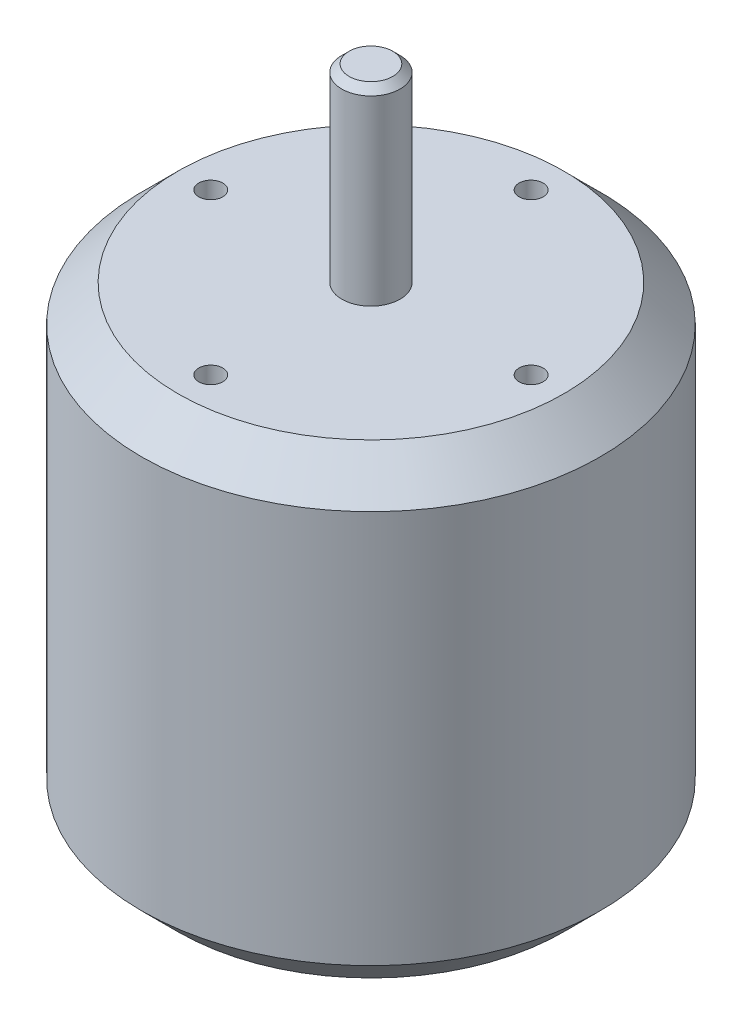
ISO-10303-21;
HEADER;
FILE_DESCRIPTION(('STEP AP214'),'2;1');
FILE_NAME('part.step','',(''),(''),'','','');
FILE_SCHEMA(('AUTOMOTIVE_DESIGN { 1 0 10303 214 1 1 1 1 }'));
ENDSEC;
DATA;
#1=APPLICATION_CONTEXT('core data for automotive mechanical design processes');
#2=APPLICATION_PROTOCOL_DEFINITION('international standard','automotive_design',2000,#1);
#3=PRODUCT_CONTEXT('',#1,'mechanical');
#4=PRODUCT('Part','Part','',(#3));
#5=PRODUCT_RELATED_PRODUCT_CATEGORY('part','',(#4));
#6=PRODUCT_DEFINITION_FORMATION('','',#4);
#7=PRODUCT_DEFINITION_CONTEXT('part definition',#1,'design');
#8=PRODUCT_DEFINITION('design','',#6,#7);
#9=PRODUCT_DEFINITION_SHAPE('','',#8);
#10=(LENGTH_UNIT() NAMED_UNIT(*) SI_UNIT(.MILLI.,.METRE.));
#11=(NAMED_UNIT(*) PLANE_ANGLE_UNIT() SI_UNIT($,.RADIAN.));
#12=(NAMED_UNIT(*) SI_UNIT($,.STERADIAN.) SOLID_ANGLE_UNIT());
#13=UNCERTAINTY_MEASURE_WITH_UNIT(LENGTH_MEASURE(1.E-05),#10,'distance_accuracy_value','');
#14=(GEOMETRIC_REPRESENTATION_CONTEXT(3) GLOBAL_UNCERTAINTY_ASSIGNED_CONTEXT((#13)) GLOBAL_UNIT_ASSIGNED_CONTEXT((#10,
#11,#12)) REPRESENTATION_CONTEXT('',''));
#15=CARTESIAN_POINT('',(0.,0.,0.));
#16=DIRECTION('',(0.,0.,1.));
#17=DIRECTION('',(1.,0.,0.));
#18=AXIS2_PLACEMENT_3D('',#15,#16,#17);
#19=CARTESIAN_POINT('',(0.,0.,0.));
#20=DIRECTION('',(0.,1.,0.));
#21=DIRECTION('',(0.,0.,1.));
#22=AXIS2_PLACEMENT_3D('',#19,#20,#21);
#23=PLANE('',#22);
#24=CARTESIAN_POINT('',(0.,0.,0.));
#25=DIRECTION('',(0.,1.,0.));
#26=DIRECTION('',(0.,0.,1.));
#27=AXIS2_PLACEMENT_3D('',#24,#25,#26);
#28=CIRCLE('',#27,26.5);
#29=CARTESIAN_POINT('',(0.,0.,26.5));
#30=VERTEX_POINT('',#29);
#31=EDGE_CURVE('E243',#30,#30,#28,.F.);
#32=ORIENTED_EDGE('',*,*,#31,.T.);
#33=EDGE_LOOP('',(#32));
#34=FACE_BOUND('',#33,.T.);
#35=CARTESIAN_POINT('',(0.,0.,0.));
#36=DIRECTION('',(0.,1.,0.));
#37=DIRECTION('',(0.,0.,1.));
#38=AXIS2_PLACEMENT_3D('',#35,#36,#37);
#39=CIRCLE('',#38,13.);
#40=CARTESIAN_POINT('',(0.,0.,13.));
#41=VERTEX_POINT('',#40);
#42=EDGE_CURVE('E249',#41,#41,#39,.F.);
#43=ORIENTED_EDGE('',*,*,#42,.F.);
#44=EDGE_LOOP('',(#43));
#45=FACE_BOUND('',#44,.T.);
#46=ADVANCED_FACE('F45',(#34,#45),#23,.F.);
#47=CARTESIAN_POINT('',(0.,64.,0.));
#48=DIRECTION('',(0.,1.,0.));
#49=DIRECTION('',(0.,0.,1.));
#50=AXIS2_PLACEMENT_3D('',#47,#48,#49);
#51=PLANE('',#50);
#52=CARTESIAN_POINT('',(0.,64.,0.));
#53=DIRECTION('',(0.,1.,0.));
#54=DIRECTION('',(0.,0.,1.));
#55=AXIS2_PLACEMENT_3D('',#52,#53,#54);
#56=CIRCLE('',#55,26.5);
#57=CARTESIAN_POINT('',(0.,64.,26.5));
#58=VERTEX_POINT('',#57);
#59=EDGE_CURVE('E246',#58,#58,#56,.T.);
#60=ORIENTED_EDGE('',*,*,#59,.T.);
#61=EDGE_LOOP('',(#60));
#62=FACE_BOUND('',#61,.T.);
#63=CARTESIAN_POINT('',(-22.,64.,-2.30437768363647E-13));
#64=DIRECTION('',(0.,1.,0.));
#65=DIRECTION('',(0.,0.,1.));
#66=AXIS2_PLACEMENT_3D('',#63,#64,#65);
#67=CIRCLE('',#66,1.64999999999999);
#68=CARTESIAN_POINT('',(-22.,64.,1.64999999999976));
#69=VERTEX_POINT('',#68);
#70=EDGE_CURVE('E119',#69,#69,#67,.T.);
#71=ORIENTED_EDGE('',*,*,#70,.F.);
#72=EDGE_LOOP('',(#71));
#73=FACE_BOUND('',#72,.T.);
#74=CARTESIAN_POINT('',(0.,64.,22.));
#75=DIRECTION('',(0.,1.,0.));
#76=DIRECTION('',(0.,0.,1.));
#77=AXIS2_PLACEMENT_3D('',#74,#75,#76);
#78=CIRCLE('',#77,1.64999999999999);
#79=CARTESIAN_POINT('',(0.,64.,23.65));
#80=VERTEX_POINT('',#79);
#81=EDGE_CURVE('E118',#80,#80,#78,.T.);
#82=ORIENTED_EDGE('',*,*,#81,.F.);
#83=EDGE_LOOP('',(#82));
#84=FACE_BOUND('',#83,.T.);
#85=CARTESIAN_POINT('',(22.,64.,0.));
#86=DIRECTION('',(0.,1.,0.));
#87=DIRECTION('',(0.,0.,1.));
#88=AXIS2_PLACEMENT_3D('',#85,#86,#87);
#89=CIRCLE('',#88,1.64999999999999);
#90=CARTESIAN_POINT('',(22.,64.,1.65000000000007));
#91=VERTEX_POINT('',#90);
#92=EDGE_CURVE('E129',#91,#91,#89,.T.);
#93=ORIENTED_EDGE('',*,*,#92,.F.);
#94=EDGE_LOOP('',(#93));
#95=FACE_BOUND('',#94,.T.);
#96=CARTESIAN_POINT('',(0.,64.,-22.));
#97=DIRECTION('',(0.,1.,0.));
#98=DIRECTION('',(0.,0.,1.));
#99=AXIS2_PLACEMENT_3D('',#96,#97,#98);
#100=CIRCLE('',#99,1.64999999999999);
#101=CARTESIAN_POINT('',(0.,64.,-20.35));
#102=VERTEX_POINT('',#101);
#103=EDGE_CURVE('E135',#102,#102,#100,.T.);
#104=ORIENTED_EDGE('',*,*,#103,.F.);
#105=EDGE_LOOP('',(#104));
#106=FACE_BOUND('',#105,.T.);
#107=CARTESIAN_POINT('',(0.,64.,0.));
#108=DIRECTION('',(0.,1.,0.));
#109=DIRECTION('',(0.,0.,1.));
#110=AXIS2_PLACEMENT_3D('',#107,#108,#109);
#111=CIRCLE('',#110,4.);
#112=CARTESIAN_POINT('',(0.,64.,4.));
#113=VERTEX_POINT('',#112);
#114=EDGE_CURVE('E155',#113,#113,#111,.T.);
#115=ORIENTED_EDGE('',*,*,#114,.F.);
#116=EDGE_LOOP('',(#115));
#117=FACE_BOUND('',#116,.T.);
#118=ADVANCED_FACE('F265',(#62,#73,#84,#95,#106,#117),#51,.T.);
#119=CARTESIAN_POINT('',(0.,64.,0.));
#120=DIRECTION('',(0.,-1.,0.));
#121=DIRECTION('',(0.,0.,-1.));
#122=AXIS2_PLACEMENT_3D('',#119,#120,#121);
#123=CYLINDRICAL_SURFACE('',#122,31.5);
#124=CARTESIAN_POINT('',(0.,4.99999999999999,0.));
#125=DIRECTION('',(0.,1.,0.));
#126=DIRECTION('',(0.,0.,1.));
#127=AXIS2_PLACEMENT_3D('',#124,#125,#126);
#128=CIRCLE('',#127,31.5);
#129=CARTESIAN_POINT('',(0.,4.99999999999999,31.5));
#130=VERTEX_POINT('',#129);
#131=EDGE_CURVE('E240',#130,#130,#128,.T.);
#132=ORIENTED_EDGE('',*,*,#131,.T.);
#133=EDGE_LOOP('',(#132));
#134=FACE_BOUND('',#133,.T.);
#135=CARTESIAN_POINT('',(0.,59.,0.));
#136=DIRECTION('',(0.,1.,0.));
#137=DIRECTION('',(0.,0.,1.));
#138=AXIS2_PLACEMENT_3D('',#135,#136,#137);
#139=CIRCLE('',#138,31.5);
#140=CARTESIAN_POINT('',(0.,59.,31.5));
#141=VERTEX_POINT('',#140);
#142=EDGE_CURVE('E233',#141,#141,#139,.F.);
#143=ORIENTED_EDGE('',*,*,#142,.T.);
#144=EDGE_LOOP('',(#143));
#145=FACE_BOUND('',#144,.T.);
#146=ADVANCED_FACE('F273',(#134,#145),#123,.T.);
#147=CARTESIAN_POINT('',(0.,90.,0.));
#148=DIRECTION('',(0.,-1.,0.));
#149=DIRECTION('',(0.,0.,-1.));
#150=AXIS2_PLACEMENT_3D('',#147,#148,#149);
#151=CYLINDRICAL_SURFACE('',#150,4.);
#152=DIRECTION('',(0.,-1.,0.));
#153=VECTOR('',#152,1.);
#154=CARTESIAN_POINT('',(-3.70809924354783,90.,1.5));
#155=LINE('',#154,#153);
#156=CARTESIAN_POINT('',(-3.70809924354783,69.,1.5));
#157=VERTEX_POINT('',#156);
#158=CARTESIAN_POINT('',(-3.70809924354783,85.,1.5));
#159=VERTEX_POINT('',#158);
#160=EDGE_CURVE('E142',#157,#159,#155,.F.);
#161=ORIENTED_EDGE('',*,*,#160,.F.);
#162=CARTESIAN_POINT('',(-3.70809924354783,69.,1.5));
#163=CARTESIAN_POINT('',(-3.70809443488223,68.9594059305553,1.50000149763685));
#164=CARTESIAN_POINT('',(-3.70876668409977,68.9188329978994,1.49835105709716));
#165=CARTESIAN_POINT('',(-3.71141698257091,68.8380093568391,1.49177843163965));
#166=CARTESIAN_POINT('',(-3.71339459320577,68.7977585447944,1.48685734569824));
#167=CARTESIAN_POINT('',(-3.72119033682707,68.678226826317,1.4672933482067));
#168=CARTESIAN_POINT('',(-3.72887225208868,68.5997974497692,1.44784901310297));
#169=CARTESIAN_POINT('',(-3.74825199333564,68.4476339471668,1.39690282812453));
#170=CARTESIAN_POINT('',(-3.75994650999366,68.3738960111435,1.3654109118427));
#171=CARTESIAN_POINT('',(-3.7860233337759,68.2326690628725,1.29134257885079));
#172=CARTESIAN_POINT('',(-3.80040794022651,68.1651854708133,1.24875666733343));
#173=CARTESIAN_POINT('',(-3.83103570457934,68.0351088724607,1.15146673631305));
#174=CARTESIAN_POINT('',(-3.84733331324471,67.9728715264412,1.0963044481655));
#175=CARTESIAN_POINT('',(-3.87949750401636,67.8582775205832,0.976395613097515));
#176=CARTESIAN_POINT('',(-3.89536399207354,67.805923002106,0.911646994469717));
#177=CARTESIAN_POINT('',(-3.92553400925355,67.7108435774906,0.771671110191598));
#178=CARTESIAN_POINT('',(-3.93976501267995,67.6685118052143,0.696160035999176));
#179=CARTESIAN_POINT('',(-3.9643883038365,67.5973265968158,0.538489868027627));
#180=CARTESIAN_POINT('',(-3.97478464304361,67.5684589267465,0.45633790318392));
#181=CARTESIAN_POINT('',(-3.98831063781509,67.5313833692295,0.311568360413161));
#182=CARTESIAN_POINT('',(-3.9926612104967,67.5196498632232,0.24994625970163));
#183=CARTESIAN_POINT('',(-3.99852089820637,67.5039443418765,0.125564806183783));
#184=CARTESIAN_POINT('',(-4.00002882328734,67.4999755768709,0.0628049882167087));
#185=CARTESIAN_POINT('',(-4.,67.5,0.));
#186=B_SPLINE_CURVE_WITH_KNOTS('',3,(#162,#163,#164,#165,#166,#167,#168,#169,#170,#171,#172,
#173,#174,#175,#176,#177,#178,#179,#180,#181,#182,#183,#184,#185),.UNSPECIFIED.,.F.,.F.,(4,2,2,
2,2,2,2,2,2,2,2,4),(0.,0.12170207065054,0.243363268593951,0.485593089370354,0.727623613350256,
0.969861963846899,1.22297737762719,1.47614757238601,1.73802530937247,1.9996255640306,
2.18773738057225,2.37592792422954),.UNSPECIFIED.);
#187=CARTESIAN_POINT('',(-4.,67.5,0.));
#188=VERTEX_POINT('',#187);
#189=EDGE_CURVE('E67',#157,#188,#186,.T.);
#190=ORIENTED_EDGE('',*,*,#189,.T.);
#191=CARTESIAN_POINT('',(-4.,67.5,0.));
#192=CARTESIAN_POINT('',(-4.0000033265242,67.4999987715417,-0.0406958829842208));
#193=CARTESIAN_POINT('',(-3.99937821643425,67.5016572436766,-0.0813709954107115));
#194=CARTESIAN_POINT('',(-3.99690675065887,67.5082636148126,-0.162404982142702));
#195=CARTESIAN_POINT('',(-3.99506072565186,67.5132106231327,-0.202763939083231));
#196=CARTESIAN_POINT('',(-3.98776419542613,67.5328868689112,-0.32265881815323));
#197=CARTESIAN_POINT('',(-3.98055464040178,67.5524519115586,-0.401351138250186));
#198=CARTESIAN_POINT('',(-3.96219014943225,67.6037487278131,-0.554057247937607));
#199=CARTESIAN_POINT('',(-3.9510373492233,67.6354739160358,-0.628073544622785));
#200=CARTESIAN_POINT('',(-3.92589331480545,67.7100889205701,-0.769768846215139));
#201=CARTESIAN_POINT('',(-3.91190018231573,67.7529862089937,-0.83744356840816));
#202=CARTESIAN_POINT('',(-3.88186303805132,67.8506106720114,-0.967344906860736));
#203=CARTESIAN_POINT('',(-3.86576126025821,67.905725774499,-1.02926635746348));
#204=CARTESIAN_POINT('',(-3.83360332452306,68.0254061833372,-1.14324026520415));
#205=CARTESIAN_POINT('',(-3.81754718614379,68.0899750568823,-1.19528897996651));
#206=CARTESIAN_POINT('',(-3.78661824913521,68.2297458027433,-1.29000216750081));
#207=CARTESIAN_POINT('',(-3.77181479391607,68.305261304648,-1.33222827734551));
#208=CARTESIAN_POINT('',(-3.74598828763861,68.4629257096993,-1.40321260233323));
#209=CARTESIAN_POINT('',(-3.73496054207913,68.5450662174502,-1.43198755826085));
#210=CARTESIAN_POINT('',(-3.72058587751726,68.6895938732748,-1.4688507799066));
#211=CARTESIAN_POINT('',(-3.71594709538589,68.750966567495,-1.4804930770667));
#212=CARTESIAN_POINT('',(-3.70968378110959,68.8748756822457,-1.49608314541372));
#213=CARTESIAN_POINT('',(-3.70806150546337,68.9374129386371,-1.50002515651037));
#214=CARTESIAN_POINT('',(-3.70809924354783,69.,-1.5));
#215=B_SPLINE_CURVE_WITH_KNOTS('',3,(#191,#192,#193,#194,#195,#196,#197,#198,#199,#200,#201,
#202,#203,#204,#205,#206,#207,#208,#209,#210,#211,#212,#213,#214),.UNSPECIFIED.,.F.,.F.,(4,2,2,
2,2,2,2,2,2,2,2,4),(0.,0.122008525653371,0.24398401945963,0.486933412549049,0.729751420715084,
0.972732249088057,1.2249558748475,1.47727491867927,1.73930674597637,2.0010115846268,
2.18839922255605,2.37592697956525),.UNSPECIFIED.);
#216=CARTESIAN_POINT('',(-3.70809924354783,69.,-1.5));
#217=VERTEX_POINT('',#216);
#218=EDGE_CURVE('E182',#188,#217,#215,.T.);
#219=ORIENTED_EDGE('',*,*,#218,.T.);
#220=DIRECTION('',(0.,-1.,0.));
#221=VECTOR('',#220,1.);
#222=CARTESIAN_POINT('',(-3.70809924354783,90.,-1.5));
#223=LINE('',#222,#221);
#224=CARTESIAN_POINT('',(-3.70809924354783,85.,-1.5));
#225=VERTEX_POINT('',#224);
#226=EDGE_CURVE('E145',#225,#217,#223,.T.);
#227=ORIENTED_EDGE('',*,*,#226,.F.);
#228=CARTESIAN_POINT('',(-3.70809924354783,85.,-1.5));
#229=CARTESIAN_POINT('',(-3.70809443488223,85.0405940694447,-1.50000149763685));
#230=CARTESIAN_POINT('',(-3.70876668409977,85.0811670021006,-1.49835105709717));
#231=CARTESIAN_POINT('',(-3.71141698257091,85.1619906431609,-1.49177843163965));
#232=CARTESIAN_POINT('',(-3.71339459320577,85.2022414552056,-1.48685734569824));
#233=CARTESIAN_POINT('',(-3.72119033682707,85.321773173683,-1.4672933482067));
#234=CARTESIAN_POINT('',(-3.72887225208868,85.4002025502309,-1.44784901310297));
#235=CARTESIAN_POINT('',(-3.74825199333564,85.5523660528332,-1.39690282812454));
#236=CARTESIAN_POINT('',(-3.75994650999366,85.6261039888565,-1.3654109118427));
#237=CARTESIAN_POINT('',(-3.7860233337759,85.7673309371275,-1.29134257885079));
#238=CARTESIAN_POINT('',(-3.80040794022651,85.8348145291867,-1.24875666733342));
#239=CARTESIAN_POINT('',(-3.83103570457934,85.9648911275393,-1.15146673631306));
#240=CARTESIAN_POINT('',(-3.84733331324471,86.0271284735588,-1.09630444816551));
#241=CARTESIAN_POINT('',(-3.87949750401636,86.1417224794168,-0.976395613097519));
#242=CARTESIAN_POINT('',(-3.89536399207354,86.194076997894,-0.911646994469718));
#243=CARTESIAN_POINT('',(-3.92553400925355,86.2891564225094,-0.771671110191598));
#244=CARTESIAN_POINT('',(-3.93976501267995,86.3314881947857,-0.696160035999176));
#245=CARTESIAN_POINT('',(-3.9643883038365,86.4026734031842,-0.538489868027629));
#246=CARTESIAN_POINT('',(-3.97478464304361,86.4315410732536,-0.456337903183923));
#247=CARTESIAN_POINT('',(-3.98831063781509,86.4686166307705,-0.311568360413165));
#248=CARTESIAN_POINT('',(-3.9926612104967,86.4803501367768,-0.249946259701634));
#249=CARTESIAN_POINT('',(-3.99852089820637,86.4960556581235,-0.125564806183788));
#250=CARTESIAN_POINT('',(-4.00002882328734,86.5000244231291,-0.0628049882167117));
#251=CARTESIAN_POINT('',(-4.,86.5,0.));
#252=B_SPLINE_CURVE_WITH_KNOTS('',3,(#228,#229,#230,#231,#232,#233,#234,#235,#236,#237,#238,
#239,#240,#241,#242,#243,#244,#245,#246,#247,#248,#249,#250,#251),.UNSPECIFIED.,.F.,.F.,(4,2,2,
2,2,2,2,2,2,2,2,4),(0.,0.12170207065054,0.243363268593951,0.485593089370354,0.727623613350272,
0.969861963846899,1.2229773776272,1.47614757238601,1.73802530937248,1.9996255640306,
2.18773738057225,2.37592792422954),.UNSPECIFIED.);
#253=CARTESIAN_POINT('',(-4.,86.5,0.));
#254=VERTEX_POINT('',#253);
#255=EDGE_CURVE('E60',#225,#254,#252,.T.);
#256=ORIENTED_EDGE('',*,*,#255,.T.);
#257=CARTESIAN_POINT('',(-4.,86.5,0.));
#258=CARTESIAN_POINT('',(-4.0000033265242,86.5000012284583,0.0406958829842172));
#259=CARTESIAN_POINT('',(-3.99937821643425,86.4983427563235,0.0813709954107074));
#260=CARTESIAN_POINT('',(-3.99690675065887,86.4917363851875,0.162404982142698));
#261=CARTESIAN_POINT('',(-3.99506072565186,86.4867893768673,0.202763939083227));
#262=CARTESIAN_POINT('',(-3.98776419542613,86.4671131310888,0.322658818153227));
#263=CARTESIAN_POINT('',(-3.98055464040178,86.4475480884414,0.401351138250184));
#264=CARTESIAN_POINT('',(-3.96219014943225,86.3962512721869,0.554057247937607));
#265=CARTESIAN_POINT('',(-3.9510373492233,86.3645260839642,0.628073544622788));
#266=CARTESIAN_POINT('',(-3.92589331480545,86.2899110794299,0.769768846215141));
#267=CARTESIAN_POINT('',(-3.91190018231573,86.2470137910063,0.83744356840816));
#268=CARTESIAN_POINT('',(-3.88186303805133,86.1493893279886,0.967344906860734));
#269=CARTESIAN_POINT('',(-3.86576126025821,86.094274225501,1.02926635746347));
#270=CARTESIAN_POINT('',(-3.83360332452306,85.9745938166628,1.14324026520414));
#271=CARTESIAN_POINT('',(-3.8175471861438,85.9100249431177,1.19528897996651));
#272=CARTESIAN_POINT('',(-3.78661824913521,85.7702541972567,1.2900021675008));
#273=CARTESIAN_POINT('',(-3.77181479391607,85.694738695352,1.33222827734551));
#274=CARTESIAN_POINT('',(-3.74598828763861,85.5370742903007,1.40321260233322));
#275=CARTESIAN_POINT('',(-3.73496054207913,85.4549337825498,1.43198755826084));
#276=CARTESIAN_POINT('',(-3.72058587751727,85.3104061267252,1.46885077990659));
#277=CARTESIAN_POINT('',(-3.71594709538589,85.249033432505,1.4804930770667));
#278=CARTESIAN_POINT('',(-3.7096837811096,85.1251243177543,1.49608314541372));
#279=CARTESIAN_POINT('',(-3.70806150546337,85.0625870613629,1.50002515651037));
#280=CARTESIAN_POINT('',(-3.70809924354783,85.,1.5));
#281=B_SPLINE_CURVE_WITH_KNOTS('',3,(#257,#258,#259,#260,#261,#262,#263,#264,#265,#266,#267,
#268,#269,#270,#271,#272,#273,#274,#275,#276,#277,#278,#279,#280),.UNSPECIFIED.,.F.,.F.,(4,2,2,
2,2,2,2,2,2,2,2,4),(0.,0.12200852565337,0.24398401945963,0.486933412549048,0.7297514207151,
0.972732249088056,1.2249558748475,1.47727491867927,1.73930674597637,2.0010115846268,
2.18839922255604,2.37592697956525),.UNSPECIFIED.);
#282=EDGE_CURVE('E227',#254,#159,#281,.T.);
#283=ORIENTED_EDGE('',*,*,#282,.T.);
#284=EDGE_LOOP('',(#161,#190,#219,#227,#256,#283));
#285=FACE_BOUND('',#284,.T.);
#286=CARTESIAN_POINT('',(0.,89.,0.));
#287=DIRECTION('',(0.,1.,0.));
#288=DIRECTION('',(0.,0.,1.));
#289=AXIS2_PLACEMENT_3D('',#286,#287,#288);
#290=CIRCLE('',#289,4.);
#291=CARTESIAN_POINT('',(0.,89.,4.));
#292=VERTEX_POINT('',#291);
#293=EDGE_CURVE('E161',#292,#292,#290,.F.);
#294=ORIENTED_EDGE('',*,*,#293,.T.);
#295=EDGE_LOOP('',(#294));
#296=FACE_BOUND('',#295,.T.);
#297=ORIENTED_EDGE('',*,*,#114,.T.);
#298=EDGE_LOOP('',(#297));
#299=FACE_BOUND('',#298,.T.);
#300=ADVANCED_FACE('F196',(#285,#296,#299),#151,.T.);
#301=CARTESIAN_POINT('',(0.,90.,0.));
#302=DIRECTION('',(0.,1.,0.));
#303=DIRECTION('',(0.,0.,1.));
#304=AXIS2_PLACEMENT_3D('',#301,#302,#303);
#305=PLANE('',#304);
#306=CARTESIAN_POINT('',(0.,90.,0.));
#307=DIRECTION('',(0.,1.,0.));
#308=DIRECTION('',(0.,0.,1.));
#309=AXIS2_PLACEMENT_3D('',#306,#307,#308);
#310=CIRCLE('',#309,3.00000000000004);
#311=CARTESIAN_POINT('',(0.,90.,3.00000000000004));
#312=VERTEX_POINT('',#311);
#313=EDGE_CURVE('E158',#312,#312,#310,.T.);
#314=ORIENTED_EDGE('',*,*,#313,.T.);
#315=EDGE_LOOP('',(#314));
#316=FACE_BOUND('',#315,.T.);
#317=ADVANCED_FACE('F282',(#316),#305,.T.);
#318=CARTESIAN_POINT('',(0.,90.,0.));
#319=DIRECTION('',(0.,-1.,0.));
#320=DIRECTION('',(0.,0.,-1.));
#321=AXIS2_PLACEMENT_3D('',#318,#319,#320);
#322=CONICAL_SURFACE('',#321,3.00000000000004,0.785398163397447);
#323=ORIENTED_EDGE('',*,*,#293,.F.);
#324=EDGE_LOOP('',(#323));
#325=FACE_BOUND('',#324,.T.);
#326=ORIENTED_EDGE('',*,*,#313,.F.);
#327=EDGE_LOOP('',(#326));
#328=FACE_BOUND('',#327,.T.);
#329=ADVANCED_FACE('F207',(#325,#328),#322,.T.);
#330=CARTESIAN_POINT('',(-31.501,67.5,-1.5));
#331=DIRECTION('',(0.,0.,-1.));
#332=DIRECTION('',(-1.,0.,0.));
#333=AXIS2_PLACEMENT_3D('',#330,#331,#332);
#334=PLANE('',#333);
#335=ORIENTED_EDGE('',*,*,#226,.T.);
#336=DIRECTION('',(1.,0.,0.));
#337=VECTOR('',#336,1.);
#338=CARTESIAN_POINT('',(0.,69.,-1.5));
#339=LINE('',#338,#337);
#340=CARTESIAN_POINT('',(0.,69.,-1.5));
#341=VERTEX_POINT('',#340);
#342=EDGE_CURVE('E167',#217,#341,#339,.T.);
#343=ORIENTED_EDGE('',*,*,#342,.T.);
#344=DIRECTION('',(0.,1.,0.));
#345=VECTOR('',#344,1.);
#346=CARTESIAN_POINT('',(0.,67.5,-1.5));
#347=LINE('',#346,#345);
#348=CARTESIAN_POINT('',(0.,85.,-1.5));
#349=VERTEX_POINT('',#348);
#350=EDGE_CURVE('E149',#341,#349,#347,.T.);
#351=ORIENTED_EDGE('',*,*,#350,.T.);
#352=DIRECTION('',(1.,0.,0.));
#353=VECTOR('',#352,1.);
#354=CARTESIAN_POINT('',(-3.70809924354783,85.,-1.5));
#355=LINE('',#354,#353);
#356=EDGE_CURVE('E164',#349,#225,#355,.F.);
#357=ORIENTED_EDGE('',*,*,#356,.T.);
#358=EDGE_LOOP('',(#335,#343,#351,#357));
#359=FACE_BOUND('',#358,.T.);
#360=ADVANCED_FACE('F327',(#359),#334,.F.);
#361=CARTESIAN_POINT('',(-31.501,67.5,1.5));
#362=DIRECTION('',(0.,0.,1.));
#363=DIRECTION('',(1.,0.,0.));
#364=AXIS2_PLACEMENT_3D('',#361,#362,#363);
#365=PLANE('',#364);
#366=DIRECTION('',(0.,-1.,0.));
#367=VECTOR('',#366,1.);
#368=CARTESIAN_POINT('',(0.,67.5,1.5));
#369=LINE('',#368,#367);
#370=CARTESIAN_POINT('',(0.,85.,1.5));
#371=VERTEX_POINT('',#370);
#372=CARTESIAN_POINT('',(0.,69.,1.5));
#373=VERTEX_POINT('',#372);
#374=EDGE_CURVE('E152',#371,#373,#369,.T.);
#375=ORIENTED_EDGE('',*,*,#374,.T.);
#376=DIRECTION('',(1.,0.,0.));
#377=VECTOR('',#376,1.);
#378=CARTESIAN_POINT('',(-3.70809924354783,69.,1.5));
#379=LINE('',#378,#377);
#380=EDGE_CURVE('E180',#373,#157,#379,.F.);
#381=ORIENTED_EDGE('',*,*,#380,.T.);
#382=ORIENTED_EDGE('',*,*,#160,.T.);
#383=DIRECTION('',(1.,0.,0.));
#384=VECTOR('',#383,1.);
#385=CARTESIAN_POINT('',(0.,85.,1.5));
#386=LINE('',#385,#384);
#387=EDGE_CURVE('E178',#159,#371,#386,.T.);
#388=ORIENTED_EDGE('',*,*,#387,.T.);
#389=EDGE_LOOP('',(#375,#381,#382,#388));
#390=FACE_BOUND('',#389,.T.);
#391=ADVANCED_FACE('F323',(#390),#365,.F.);
#392=CARTESIAN_POINT('',(0.,0.,0.));
#393=DIRECTION('',(-1.,0.,0.));
#394=DIRECTION('',(0.,0.,1.));
#395=AXIS2_PLACEMENT_3D('',#392,#393,#394);
#396=PLANE('',#395);
#397=ORIENTED_EDGE('',*,*,#350,.F.);
#398=CARTESIAN_POINT('',(0.,69.,0.));
#399=DIRECTION('',(-1.,0.,0.));
#400=DIRECTION('',(0.,0.,1.));
#401=AXIS2_PLACEMENT_3D('',#398,#399,#400);
#402=CIRCLE('',#401,1.5);
#403=CARTESIAN_POINT('',(0.,67.5,0.));
#404=VERTEX_POINT('',#403);
#405=EDGE_CURVE('E176',#341,#404,#402,.T.);
#406=ORIENTED_EDGE('',*,*,#405,.T.);
#407=CARTESIAN_POINT('',(0.,69.,0.));
#408=DIRECTION('',(-1.,0.,0.));
#409=DIRECTION('',(0.,0.,1.));
#410=AXIS2_PLACEMENT_3D('',#407,#408,#409);
#411=CIRCLE('',#410,1.5);
#412=EDGE_CURVE('E174',#404,#373,#411,.T.);
#413=ORIENTED_EDGE('',*,*,#412,.T.);
#414=ORIENTED_EDGE('',*,*,#374,.F.);
#415=CARTESIAN_POINT('',(0.,85.,0.));
#416=DIRECTION('',(-1.,0.,0.));
#417=DIRECTION('',(0.,0.,1.));
#418=AXIS2_PLACEMENT_3D('',#415,#416,#417);
#419=CIRCLE('',#418,1.5);
#420=CARTESIAN_POINT('',(0.,86.5,0.));
#421=VERTEX_POINT('',#420);
#422=EDGE_CURVE('E170',#371,#421,#419,.T.);
#423=ORIENTED_EDGE('',*,*,#422,.T.);
#424=CARTESIAN_POINT('',(0.,85.,0.));
#425=DIRECTION('',(-1.,0.,0.));
#426=DIRECTION('',(0.,0.,1.));
#427=AXIS2_PLACEMENT_3D('',#424,#425,#426);
#428=CIRCLE('',#427,1.5);
#429=EDGE_CURVE('E172',#421,#349,#428,.T.);
#430=ORIENTED_EDGE('',*,*,#429,.T.);
#431=EDGE_LOOP('',(#397,#406,#413,#414,#423,#430));
#432=FACE_BOUND('',#431,.T.);
#433=ADVANCED_FACE('F212',(#432),#396,.T.);
#434=CARTESIAN_POINT('',(-31.501,69.,0.));
#435=DIRECTION('',(-1.,0.,0.));
#436=DIRECTION('',(0.,0.,1.));
#437=AXIS2_PLACEMENT_3D('',#434,#435,#436);
#438=CYLINDRICAL_SURFACE('',#437,1.5);
#439=DIRECTION('',(1.,0.,0.));
#440=VECTOR('',#439,1.);
#441=CARTESIAN_POINT('',(0.,67.5,0.));
#442=LINE('',#441,#440);
#443=EDGE_CURVE('E146',#188,#404,#442,.T.);
#444=ORIENTED_EDGE('',*,*,#443,.F.);
#445=ORIENTED_EDGE('',*,*,#189,.F.);
#446=ORIENTED_EDGE('',*,*,#380,.F.);
#447=ORIENTED_EDGE('',*,*,#412,.F.);
#448=EDGE_LOOP('',(#444,#445,#446,#447));
#449=FACE_BOUND('',#448,.T.);
#450=ADVANCED_FACE('F205',(#449),#438,.F.);
#451=CARTESIAN_POINT('',(-31.501,69.,0.));
#452=DIRECTION('',(-1.,0.,0.));
#453=DIRECTION('',(0.,0.,1.));
#454=AXIS2_PLACEMENT_3D('',#451,#452,#453);
#455=CYLINDRICAL_SURFACE('',#454,1.5);
#456=ORIENTED_EDGE('',*,*,#218,.F.);
#457=ORIENTED_EDGE('',*,*,#443,.T.);
#458=ORIENTED_EDGE('',*,*,#405,.F.);
#459=ORIENTED_EDGE('',*,*,#342,.F.);
#460=EDGE_LOOP('',(#456,#457,#458,#459));
#461=FACE_BOUND('',#460,.T.);
#462=ADVANCED_FACE('F200',(#461),#455,.F.);
#463=CARTESIAN_POINT('',(-31.501,85.,0.));
#464=DIRECTION('',(-1.,0.,0.));
#465=DIRECTION('',(0.,0.,1.));
#466=AXIS2_PLACEMENT_3D('',#463,#464,#465);
#467=CYLINDRICAL_SURFACE('',#466,1.5);
#468=ORIENTED_EDGE('',*,*,#387,.F.);
#469=ORIENTED_EDGE('',*,*,#282,.F.);
#470=DIRECTION('',(1.,0.,0.));
#471=VECTOR('',#470,1.);
#472=CARTESIAN_POINT('',(-3.70809924354783,86.5,0.));
#473=LINE('',#472,#471);
#474=EDGE_CURVE('E141',#421,#254,#473,.F.);
#475=ORIENTED_EDGE('',*,*,#474,.F.);
#476=ORIENTED_EDGE('',*,*,#422,.F.);
#477=EDGE_LOOP('',(#468,#469,#475,#476));
#478=FACE_BOUND('',#477,.T.);
#479=ADVANCED_FACE('F204',(#478),#467,.F.);
#480=CARTESIAN_POINT('',(-31.501,85.,0.));
#481=DIRECTION('',(-1.,0.,0.));
#482=DIRECTION('',(0.,0.,1.));
#483=AXIS2_PLACEMENT_3D('',#480,#481,#482);
#484=CYLINDRICAL_SURFACE('',#483,1.5);
#485=ORIENTED_EDGE('',*,*,#255,.F.);
#486=ORIENTED_EDGE('',*,*,#356,.F.);
#487=ORIENTED_EDGE('',*,*,#429,.F.);
#488=ORIENTED_EDGE('',*,*,#474,.T.);
#489=EDGE_LOOP('',(#485,#486,#487,#488));
#490=FACE_BOUND('',#489,.T.);
#491=ADVANCED_FACE('F214',(#490),#484,.F.);
#492=CARTESIAN_POINT('',(0.,51.9,-22.));
#493=DIRECTION('',(0.,1.,0.));
#494=DIRECTION('',(0.,0.,1.));
#495=AXIS2_PLACEMENT_3D('',#492,#493,#494);
#496=CONICAL_SURFACE('',#495,1.64999999999999,1.02974425867665);
#497=CARTESIAN_POINT('',(0.,50.9085799786045,-22.));
#498=VERTEX_POINT('',#497);
#499=VERTEX_LOOP('',#498);
#500=FACE_BOUND('',#499,.T.);
#501=CARTESIAN_POINT('',(0.,51.9,-22.));
#502=DIRECTION('',(0.,1.,0.));
#503=DIRECTION('',(0.,0.,1.));
#504=AXIS2_PLACEMENT_3D('',#501,#502,#503);
#505=CIRCLE('',#504,1.64999999999999);
#506=CARTESIAN_POINT('',(0.,51.9,-20.35));
#507=VERTEX_POINT('',#506);
#508=EDGE_CURVE('E138',#507,#507,#505,.T.);
#509=ORIENTED_EDGE('',*,*,#508,.T.);
#510=EDGE_LOOP('',(#509));
#511=FACE_BOUND('',#510,.T.);
#512=ADVANCED_FACE('F218',(#500,#511),#496,.F.);
#513=CARTESIAN_POINT('',(0.,64.,-22.));
#514=DIRECTION('',(0.,1.,0.));
#515=DIRECTION('',(0.,0.,1.));
#516=AXIS2_PLACEMENT_3D('',#513,#514,#515);
#517=CYLINDRICAL_SURFACE('',#516,1.64999999999999);
#518=ORIENTED_EDGE('',*,*,#508,.F.);
#519=EDGE_LOOP('',(#518));
#520=FACE_BOUND('',#519,.T.);
#521=ORIENTED_EDGE('',*,*,#103,.T.);
#522=EDGE_LOOP('',(#521));
#523=FACE_BOUND('',#522,.T.);
#524=ADVANCED_FACE('F303',(#520,#523),#517,.F.);
#525=CARTESIAN_POINT('',(22.,51.9,0.));
#526=DIRECTION('',(0.,1.,0.));
#527=DIRECTION('',(0.,0.,1.));
#528=AXIS2_PLACEMENT_3D('',#525,#526,#527);
#529=CONICAL_SURFACE('',#528,1.64999999999999,1.02974425867665);
#530=CARTESIAN_POINT('',(22.,50.9085799786045,0.));
#531=VERTEX_POINT('',#530);
#532=VERTEX_LOOP('',#531);
#533=FACE_BOUND('',#532,.T.);
#534=CARTESIAN_POINT('',(22.,51.9,0.));
#535=DIRECTION('',(0.,1.,0.));
#536=DIRECTION('',(0.,0.,1.));
#537=AXIS2_PLACEMENT_3D('',#534,#535,#536);
#538=CIRCLE('',#537,1.64999999999999);
#539=CARTESIAN_POINT('',(22.,51.9,1.65000000000006));
#540=VERTEX_POINT('',#539);
#541=EDGE_CURVE('E132',#540,#540,#538,.T.);
#542=ORIENTED_EDGE('',*,*,#541,.T.);
#543=EDGE_LOOP('',(#542));
#544=FACE_BOUND('',#543,.T.);
#545=ADVANCED_FACE('F305',(#533,#544),#529,.F.);
#546=CARTESIAN_POINT('',(22.,64.,0.));
#547=DIRECTION('',(0.,1.,0.));
#548=DIRECTION('',(0.,0.,1.));
#549=AXIS2_PLACEMENT_3D('',#546,#547,#548);
#550=CYLINDRICAL_SURFACE('',#549,1.64999999999999);
#551=ORIENTED_EDGE('',*,*,#541,.F.);
#552=EDGE_LOOP('',(#551));
#553=FACE_BOUND('',#552,.T.);
#554=ORIENTED_EDGE('',*,*,#92,.T.);
#555=EDGE_LOOP('',(#554));
#556=FACE_BOUND('',#555,.T.);
#557=ADVANCED_FACE('F312',(#553,#556),#550,.F.);
#558=CARTESIAN_POINT('',(0.,51.9,22.));
#559=DIRECTION('',(0.,1.,0.));
#560=DIRECTION('',(0.,0.,1.));
#561=AXIS2_PLACEMENT_3D('',#558,#559,#560);
#562=CONICAL_SURFACE('',#561,1.64999999999999,1.02974425867665);
#563=CARTESIAN_POINT('',(0.,50.9085799786045,22.));
#564=VERTEX_POINT('',#563);
#565=VERTEX_LOOP('',#564);
#566=FACE_BOUND('',#565,.T.);
#567=CARTESIAN_POINT('',(0.,51.9,22.));
#568=DIRECTION('',(0.,1.,0.));
#569=DIRECTION('',(0.,0.,1.));
#570=AXIS2_PLACEMENT_3D('',#567,#568,#569);
#571=CIRCLE('',#570,1.64999999999999);
#572=CARTESIAN_POINT('',(0.,51.9,23.65));
#573=VERTEX_POINT('',#572);
#574=EDGE_CURVE('E122',#573,#573,#571,.T.);
#575=ORIENTED_EDGE('',*,*,#574,.T.);
#576=EDGE_LOOP('',(#575));
#577=FACE_BOUND('',#576,.T.);
#578=ADVANCED_FACE('F402',(#566,#577),#562,.F.);
#579=CARTESIAN_POINT('',(0.,64.,22.));
#580=DIRECTION('',(0.,1.,0.));
#581=DIRECTION('',(0.,0.,1.));
#582=AXIS2_PLACEMENT_3D('',#579,#580,#581);
#583=CYLINDRICAL_SURFACE('',#582,1.64999999999999);
#584=ORIENTED_EDGE('',*,*,#574,.F.);
#585=EDGE_LOOP('',(#584));
#586=FACE_BOUND('',#585,.T.);
#587=ORIENTED_EDGE('',*,*,#81,.T.);
#588=EDGE_LOOP('',(#587));
#589=FACE_BOUND('',#588,.T.);
#590=ADVANCED_FACE('F112',(#586,#589),#583,.F.);
#591=CARTESIAN_POINT('',(-22.,51.9,-2.30437768363647E-13));
#592=DIRECTION('',(0.,1.,0.));
#593=DIRECTION('',(0.,0.,1.));
#594=AXIS2_PLACEMENT_3D('',#591,#592,#593);
#595=CONICAL_SURFACE('',#594,1.64999999999999,1.02974425867665);
#596=CARTESIAN_POINT('',(-22.,50.9085799786045,-2.30437768363647E-13));
#597=VERTEX_POINT('',#596);
#598=VERTEX_LOOP('',#597);
#599=FACE_BOUND('',#598,.T.);
#600=CARTESIAN_POINT('',(-22.,51.9,-2.30437768363647E-13));
#601=DIRECTION('',(0.,1.,0.));
#602=DIRECTION('',(0.,0.,1.));
#603=AXIS2_PLACEMENT_3D('',#600,#601,#602);
#604=CIRCLE('',#603,1.64999999999999);
#605=CARTESIAN_POINT('',(-22.,51.9,1.64999999999976));
#606=VERTEX_POINT('',#605);
#607=EDGE_CURVE('E116',#606,#606,#604,.T.);
#608=ORIENTED_EDGE('',*,*,#607,.T.);
#609=EDGE_LOOP('',(#608));
#610=FACE_BOUND('',#609,.T.);
#611=ADVANCED_FACE('F108',(#599,#610),#595,.F.);
#612=CARTESIAN_POINT('',(-22.,64.,-2.30437768363647E-13));
#613=DIRECTION('',(0.,1.,0.));
#614=DIRECTION('',(0.,0.,1.));
#615=AXIS2_PLACEMENT_3D('',#612,#613,#614);
#616=CYLINDRICAL_SURFACE('',#615,1.64999999999999);
#617=ORIENTED_EDGE('',*,*,#607,.F.);
#618=EDGE_LOOP('',(#617));
#619=FACE_BOUND('',#618,.T.);
#620=ORIENTED_EDGE('',*,*,#70,.T.);
#621=EDGE_LOOP('',(#620));
#622=FACE_BOUND('',#621,.T.);
#623=ADVANCED_FACE('F111',(#619,#622),#616,.F.);
#624=CARTESIAN_POINT('',(0.,4.99999999999999,0.));
#625=DIRECTION('',(0.,1.,0.));
#626=DIRECTION('',(0.,0.,1.));
#627=AXIS2_PLACEMENT_3D('',#624,#625,#626);
#628=CONICAL_SURFACE('',#627,31.5,0.785398163397451);
#629=ORIENTED_EDGE('',*,*,#31,.F.);
#630=EDGE_LOOP('',(#629));
#631=FACE_BOUND('',#630,.T.);
#632=ORIENTED_EDGE('',*,*,#131,.F.);
#633=EDGE_LOOP('',(#632));
#634=FACE_BOUND('',#633,.T.);
#635=ADVANCED_FACE('F289',(#631,#634),#628,.T.);
#636=CARTESIAN_POINT('',(0.,64.,0.));
#637=DIRECTION('',(0.,-1.,0.));
#638=DIRECTION('',(0.,0.,-1.));
#639=AXIS2_PLACEMENT_3D('',#636,#637,#638);
#640=CONICAL_SURFACE('',#639,26.5,0.785398163397447);
#641=ORIENTED_EDGE('',*,*,#142,.F.);
#642=EDGE_LOOP('',(#641));
#643=FACE_BOUND('',#642,.T.);
#644=ORIENTED_EDGE('',*,*,#59,.F.);
#645=EDGE_LOOP('',(#644));
#646=FACE_BOUND('',#645,.T.);
#647=ADVANCED_FACE('F287',(#643,#646),#640,.T.);
#648=CARTESIAN_POINT('',(0.,-7.,0.));
#649=DIRECTION('',(0.,1.,0.));
#650=DIRECTION('',(0.,0.,1.));
#651=AXIS2_PLACEMENT_3D('',#648,#649,#650);
#652=CYLINDRICAL_SURFACE('',#651,13.);
#653=CARTESIAN_POINT('',(0.,-5.99999999999999,0.));
#654=DIRECTION('',(0.,-1.,0.));
#655=DIRECTION('',(0.,0.,-1.));
#656=AXIS2_PLACEMENT_3D('',#653,#654,#655);
#657=CIRCLE('',#656,13.);
#658=CARTESIAN_POINT('',(0.,-5.99999999999999,-13.));
#659=VERTEX_POINT('',#658);
#660=EDGE_CURVE('E11',#659,#659,#657,.F.);
#661=ORIENTED_EDGE('',*,*,#660,.T.);
#662=EDGE_LOOP('',(#661));
#663=FACE_BOUND('',#662,.T.);
#664=ORIENTED_EDGE('',*,*,#42,.T.);
#665=EDGE_LOOP('',(#664));
#666=FACE_BOUND('',#665,.T.);
#667=ADVANCED_FACE('F261',(#663,#666),#652,.T.);
#668=CARTESIAN_POINT('',(0.,-7.,0.));
#669=DIRECTION('',(0.,-1.,0.));
#670=DIRECTION('',(0.,0.,-1.));
#671=AXIS2_PLACEMENT_3D('',#668,#669,#670);
#672=PLANE('',#671);
#673=CARTESIAN_POINT('',(0.,-7.,0.));
#674=DIRECTION('',(0.,-1.,0.));
#675=DIRECTION('',(0.,0.,-1.));
#676=AXIS2_PLACEMENT_3D('',#673,#674,#675);
#677=CIRCLE('',#676,12.);
#678=CARTESIAN_POINT('',(0.,-7.,-12.));
#679=VERTEX_POINT('',#678);
#680=EDGE_CURVE('E53',#679,#679,#677,.T.);
#681=ORIENTED_EDGE('',*,*,#680,.T.);
#682=EDGE_LOOP('',(#681));
#683=FACE_BOUND('',#682,.T.);
#684=ADVANCED_FACE('F254',(#683),#672,.T.);
#685=CARTESIAN_POINT('',(0.,-7.,0.));
#686=DIRECTION('',(0.,1.,0.));
#687=DIRECTION('',(0.,0.,1.));
#688=AXIS2_PLACEMENT_3D('',#685,#686,#687);
#689=CONICAL_SURFACE('',#688,12.,0.785398163397447);
#690=ORIENTED_EDGE('',*,*,#660,.F.);
#691=EDGE_LOOP('',(#690));
#692=FACE_BOUND('',#691,.T.);
#693=ORIENTED_EDGE('',*,*,#680,.F.);
#694=EDGE_LOOP('',(#693));
#695=FACE_BOUND('',#694,.T.);
#696=ADVANCED_FACE('F47',(#692,#695),#689,.T.);
#697=CLOSED_SHELL('',(#46,#118,#146,#300,#317,#329,#360,#391,#433,#450,#462,#479,#491,#512,#524,
#545,#557,#578,#590,#611,#623,#635,#647,#667,#684,#696));
#698=MANIFOLD_SOLID_BREP('B2',#697);
#699=ADVANCED_BREP_SHAPE_REPRESENTATION('',(#18,#698),#14);
#700=SHAPE_DEFINITION_REPRESENTATION(#9,#699);
ENDSEC;
END-ISO-10303-21;
